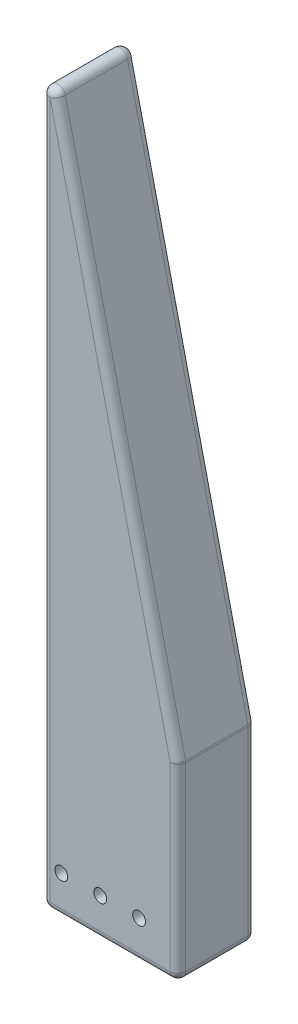
ISO-10303-21;
HEADER;
FILE_DESCRIPTION(('STEP AP214'),'2;1');
FILE_NAME('part.step','',(''),(''),'','','');
FILE_SCHEMA(('AUTOMOTIVE_DESIGN { 1 0 10303 214 1 1 1 1 }'));
ENDSEC;
DATA;
#1=APPLICATION_CONTEXT('core data for automotive mechanical design processes');
#2=APPLICATION_PROTOCOL_DEFINITION('international standard','automotive_design',2000,#1);
#3=PRODUCT_CONTEXT('',#1,'mechanical');
#4=PRODUCT('Part','Part','',(#3));
#5=PRODUCT_RELATED_PRODUCT_CATEGORY('part','',(#4));
#6=PRODUCT_DEFINITION_FORMATION('','',#4);
#7=PRODUCT_DEFINITION_CONTEXT('part definition',#1,'design');
#8=PRODUCT_DEFINITION('design','',#6,#7);
#9=PRODUCT_DEFINITION_SHAPE('','',#8);
#10=(LENGTH_UNIT() NAMED_UNIT(*) SI_UNIT(.MILLI.,.METRE.));
#11=(NAMED_UNIT(*) PLANE_ANGLE_UNIT() SI_UNIT($,.RADIAN.));
#12=(NAMED_UNIT(*) SI_UNIT($,.STERADIAN.) SOLID_ANGLE_UNIT());
#13=UNCERTAINTY_MEASURE_WITH_UNIT(LENGTH_MEASURE(1.E-05),#10,'distance_accuracy_value','');
#14=(GEOMETRIC_REPRESENTATION_CONTEXT(3) GLOBAL_UNCERTAINTY_ASSIGNED_CONTEXT((#13)) GLOBAL_UNIT_ASSIGNED_CONTEXT((#10,
#11,#12)) REPRESENTATION_CONTEXT('',''));
#15=CARTESIAN_POINT('',(0.,0.,0.));
#16=DIRECTION('',(0.,0.,1.));
#17=DIRECTION('',(1.,0.,0.));
#18=AXIS2_PLACEMENT_3D('',#15,#16,#17);
#19=CARTESIAN_POINT('',(48.599616303112,8.04367159339267,25.4));
#20=DIRECTION('',(1.,0.,0.));
#21=DIRECTION('',(0.,0.,-1.));
#22=AXIS2_PLACEMENT_3D('',#19,#20,#21);
#23=PLANE('',#22);
#24=DIRECTION('',(0.,-1.,0.));
#25=VECTOR('',#24,1.);
#26=CARTESIAN_POINT('',(48.599616303112,260.300358648793,22.86));
#27=LINE('',#26,#25);
#28=CARTESIAN_POINT('',(48.599616303112,10.5836715933927,22.86));
#29=VERTEX_POINT('',#28);
#30=CARTESIAN_POINT('',(48.599616303112,238.192735532687,22.86));
#31=VERTEX_POINT('',#30);
#32=EDGE_CURVE('E181',#29,#31,#27,.F.);
#33=ORIENTED_EDGE('',*,*,#32,.T.);
#34=DIRECTION('',(0.,0.,-1.));
#35=VECTOR('',#34,1.);
#36=CARTESIAN_POINT('',(48.599616303112,238.192735532687,25.4));
#37=LINE('',#36,#35);
#38=CARTESIAN_POINT('',(48.599616303112,238.192735532687,2.54));
#39=VERTEX_POINT('',#38);
#40=EDGE_CURVE('E184',#31,#39,#37,.T.);
#41=ORIENTED_EDGE('',*,*,#40,.T.);
#42=DIRECTION('',(0.,-1.,0.));
#43=VECTOR('',#42,1.);
#44=CARTESIAN_POINT('',(48.599616303112,8.04367159339267,2.54));
#45=LINE('',#44,#43);
#46=CARTESIAN_POINT('',(48.599616303112,10.5836715933927,2.54));
#47=VERTEX_POINT('',#46);
#48=EDGE_CURVE('E179',#39,#47,#45,.T.);
#49=ORIENTED_EDGE('',*,*,#48,.T.);
#50=DIRECTION('',(0.,0.,-1.));
#51=VECTOR('',#50,1.);
#52=CARTESIAN_POINT('',(48.599616303112,10.5836715933927,25.4));
#53=LINE('',#52,#51);
#54=EDGE_CURVE('E177',#47,#29,#53,.F.);
#55=ORIENTED_EDGE('',*,*,#54,.T.);
#56=EDGE_LOOP('',(#33,#41,#49,#55));
#57=FACE_BOUND('',#56,.T.);
#58=ADVANCED_FACE('F33',(#57),#23,.F.);
#59=CARTESIAN_POINT('',(92.9226162993558,8.04367159339267,25.4));
#60=DIRECTION('',(0.,1.,0.));
#61=DIRECTION('',(0.,0.,1.));
#62=AXIS2_PLACEMENT_3D('',#59,#60,#61);
#63=PLANE('',#62);
#64=DIRECTION('',(1.,0.,0.));
#65=VECTOR('',#64,1.);
#66=CARTESIAN_POINT('',(92.9226162993558,8.04367159339267,2.54));
#67=LINE('',#66,#65);
#68=CARTESIAN_POINT('',(51.139616303112,8.04367159339267,2.54));
#69=VERTEX_POINT('',#68);
#70=CARTESIAN_POINT('',(90.3826162993558,8.04367159339267,2.54));
#71=VERTEX_POINT('',#70);
#72=EDGE_CURVE('E197',#69,#71,#67,.T.);
#73=ORIENTED_EDGE('',*,*,#72,.T.);
#74=DIRECTION('',(0.,0.,-1.));
#75=VECTOR('',#74,1.);
#76=CARTESIAN_POINT('',(90.3826162993558,8.04367159339267,25.4));
#77=LINE('',#76,#75);
#78=CARTESIAN_POINT('',(90.3826162993558,8.04367159339267,22.86));
#79=VERTEX_POINT('',#78);
#80=EDGE_CURVE('E200',#71,#79,#77,.F.);
#81=ORIENTED_EDGE('',*,*,#80,.T.);
#82=DIRECTION('',(1.,0.,0.));
#83=VECTOR('',#82,1.);
#84=CARTESIAN_POINT('',(48.599616303112,8.04367159339267,22.86));
#85=LINE('',#84,#83);
#86=CARTESIAN_POINT('',(51.139616303112,8.04367159339267,22.86));
#87=VERTEX_POINT('',#86);
#88=EDGE_CURVE('E140',#79,#87,#85,.F.);
#89=ORIENTED_EDGE('',*,*,#88,.T.);
#90=DIRECTION('',(0.,0.,-1.));
#91=VECTOR('',#90,1.);
#92=CARTESIAN_POINT('',(51.139616303112,8.04367159339267,25.4));
#93=LINE('',#92,#91);
#94=EDGE_CURVE('E195',#87,#69,#93,.T.);
#95=ORIENTED_EDGE('',*,*,#94,.T.);
#96=EDGE_LOOP('',(#73,#81,#89,#95));
#97=FACE_BOUND('',#96,.T.);
#98=ADVANCED_FACE('F297',(#97),#63,.F.);
#99=CARTESIAN_POINT('',(92.9226162993558,8.04367159339267,25.4));
#100=DIRECTION('',(-1.,0.,0.));
#101=DIRECTION('',(0.,0.,1.));
#102=AXIS2_PLACEMENT_3D('',#99,#100,#101);
#103=PLANE('',#102);
#104=DIRECTION('',(0.,1.,0.));
#105=VECTOR('',#104,1.);
#106=CARTESIAN_POINT('',(92.9226162993558,8.04367159339267,22.86));
#107=LINE('',#106,#105);
#108=CARTESIAN_POINT('',(92.9226162993558,69.6657100867779,22.86));
#109=VERTEX_POINT('',#108);
#110=CARTESIAN_POINT('',(92.9226162993558,10.5836715933927,22.86));
#111=VERTEX_POINT('',#110);
#112=EDGE_CURVE('E53',#109,#111,#107,.F.);
#113=ORIENTED_EDGE('',*,*,#112,.T.);
#114=DIRECTION('',(0.,0.,-1.));
#115=VECTOR('',#114,1.);
#116=CARTESIAN_POINT('',(92.9226162993558,10.5836715933927,25.4));
#117=LINE('',#116,#115);
#118=CARTESIAN_POINT('',(92.9226162993558,10.5836715933927,2.54));
#119=VERTEX_POINT('',#118);
#120=EDGE_CURVE('E11',#111,#119,#117,.T.);
#121=ORIENTED_EDGE('',*,*,#120,.T.);
#122=DIRECTION('',(0.,1.,0.));
#123=VECTOR('',#122,1.);
#124=CARTESIAN_POINT('',(92.9226162993558,8.04367159339267,2.54));
#125=LINE('',#124,#123);
#126=CARTESIAN_POINT('',(92.9226162993558,69.6657100867779,2.54));
#127=VERTEX_POINT('',#126);
#128=EDGE_CURVE('E42',#119,#127,#125,.T.);
#129=ORIENTED_EDGE('',*,*,#128,.T.);
#130=DIRECTION('',(0.,0.,-1.));
#131=VECTOR('',#130,1.);
#132=CARTESIAN_POINT('',(92.9226162993558,69.6657100867779,25.4));
#133=LINE('',#132,#131);
#134=EDGE_CURVE('E202',#127,#109,#133,.F.);
#135=ORIENTED_EDGE('',*,*,#134,.T.);
#136=EDGE_LOOP('',(#113,#121,#129,#135));
#137=FACE_BOUND('',#136,.T.);
#138=ADVANCED_FACE('F303',(#137),#103,.F.);
#139=CARTESIAN_POINT('',(92.9226162993558,69.9575370265677,25.4));
#140=DIRECTION('',(-0.973943383515077,-0.226791282255742,0.));
#141=DIRECTION('',(0.226791282255742,-0.973943383515077,0.));
#142=AXIS2_PLACEMENT_3D('',#139,#140,#141);
#143=PLANE('',#142);
#144=DIRECTION('',(-0.226791282255742,0.973943383515077,0.));
#145=VECTOR('',#144,1.);
#146=CARTESIAN_POINT('',(92.9226162993558,69.9575370265677,22.86));
#147=LINE('',#146,#145);
#148=CARTESIAN_POINT('',(53.6134324972403,238.768785389617,22.86));
#149=VERTEX_POINT('',#148);
#150=CARTESIAN_POINT('',(92.8564324934841,70.2417599437075,22.86));
#151=VERTEX_POINT('',#150);
#152=EDGE_CURVE('E172',#149,#151,#147,.F.);
#153=ORIENTED_EDGE('',*,*,#152,.T.);
#154=DIRECTION('',(0.,0.,-1.));
#155=VECTOR('',#154,1.);
#156=CARTESIAN_POINT('',(92.8564324934841,70.2417599437075,25.4));
#157=LINE('',#156,#155);
#158=CARTESIAN_POINT('',(92.8564324934841,70.2417599437075,2.54));
#159=VERTEX_POINT('',#158);
#160=EDGE_CURVE('E175',#151,#159,#157,.T.);
#161=ORIENTED_EDGE('',*,*,#160,.T.);
#162=DIRECTION('',(-0.226791282255742,0.973943383515077,0.));
#163=VECTOR('',#162,1.);
#164=CARTESIAN_POINT('',(92.9226162993558,69.9575370265677,2.54));
#165=LINE('',#164,#163);
#166=CARTESIAN_POINT('',(53.6134324972403,238.768785389617,2.54));
#167=VERTEX_POINT('',#166);
#168=EDGE_CURVE('E170',#159,#167,#165,.T.);
#169=ORIENTED_EDGE('',*,*,#168,.T.);
#170=DIRECTION('',(0.,0.,-1.));
#171=VECTOR('',#170,1.);
#172=CARTESIAN_POINT('',(53.6134324972403,238.768785389617,25.4));
#173=LINE('',#172,#171);
#174=EDGE_CURVE('E168',#167,#149,#173,.F.);
#175=ORIENTED_EDGE('',*,*,#174,.T.);
#176=EDGE_LOOP('',(#153,#161,#169,#175));
#177=FACE_BOUND('',#176,.T.);
#178=ADVANCED_FACE('F292',(#177),#143,.F.);
#179=CARTESIAN_POINT('',(0.,0.,25.4));
#180=DIRECTION('',(0.,0.,1.));
#181=DIRECTION('',(1.,0.,0.));
#182=AXIS2_PLACEMENT_3D('',#179,#180,#181);
#183=PLANE('',#182);
#184=DIRECTION('',(0.,1.,0.));
#185=VECTOR('',#184,1.);
#186=CARTESIAN_POINT('',(90.3826162993558,69.9575370265677,25.4));
#187=LINE('',#186,#185);
#188=CARTESIAN_POINT('',(90.3826162993558,10.5836715933927,25.4));
#189=VERTEX_POINT('',#188);
#190=CARTESIAN_POINT('',(90.3826162993558,69.6657100867779,25.4));
#191=VERTEX_POINT('',#190);
#192=EDGE_CURVE('E126',#189,#191,#187,.T.);
#193=ORIENTED_EDGE('',*,*,#192,.T.);
#194=DIRECTION('',(-0.226791282255742,0.973943383515077,0.));
#195=VECTOR('',#194,1.);
#196=CARTESIAN_POINT('',(46.1258001089837,259.724308791863,25.4));
#197=LINE('',#196,#195);
#198=CARTESIAN_POINT('',(51.139616303112,238.192735532687,25.4));
#199=VERTEX_POINT('',#198);
#200=EDGE_CURVE('E166',#191,#199,#197,.T.);
#201=ORIENTED_EDGE('',*,*,#200,.T.);
#202=DIRECTION('',(0.,-1.,0.));
#203=VECTOR('',#202,1.);
#204=CARTESIAN_POINT('',(51.139616303112,8.04367159339267,25.4));
#205=LINE('',#204,#203);
#206=CARTESIAN_POINT('',(51.139616303112,10.5836715933927,25.4));
#207=VERTEX_POINT('',#206);
#208=EDGE_CURVE('E129',#199,#207,#205,.T.);
#209=ORIENTED_EDGE('',*,*,#208,.T.);
#210=DIRECTION('',(1.,0.,0.));
#211=VECTOR('',#210,1.);
#212=CARTESIAN_POINT('',(92.9226162993558,10.5836715933927,25.4));
#213=LINE('',#212,#211);
#214=EDGE_CURVE('E120',#207,#189,#213,.T.);
#215=ORIENTED_EDGE('',*,*,#214,.T.);
#216=EDGE_LOOP('',(#193,#201,#209,#215));
#217=FACE_BOUND('',#216,.T.);
#218=CARTESIAN_POINT('',(80.222616329776,20.6166715388885,25.4));
#219=DIRECTION('',(0.,0.,-1.));
#220=DIRECTION('',(-1.,0.,0.));
#221=AXIS2_PLACEMENT_3D('',#218,#219,#220);
#222=CIRCLE('',#221,2.0955);
#223=CARTESIAN_POINT('',(78.127116329776,20.6166715388885,25.4));
#224=VERTEX_POINT('',#223);
#225=EDGE_CURVE('E264',#224,#224,#222,.T.);
#226=ORIENTED_EDGE('',*,*,#225,.T.);
#227=EDGE_LOOP('',(#226));
#228=FACE_BOUND('',#227,.T.);
#229=CARTESIAN_POINT('',(67.522616329776,20.6166715388888,25.4));
#230=DIRECTION('',(0.,0.,-1.));
#231=DIRECTION('',(-1.,0.,0.));
#232=AXIS2_PLACEMENT_3D('',#229,#230,#231);
#233=CIRCLE('',#232,2.0955);
#234=CARTESIAN_POINT('',(65.427116329776,20.6166715388888,25.4));
#235=VERTEX_POINT('',#234);
#236=EDGE_CURVE('E274',#235,#235,#233,.T.);
#237=ORIENTED_EDGE('',*,*,#236,.T.);
#238=EDGE_LOOP('',(#237));
#239=FACE_BOUND('',#238,.T.);
#240=CARTESIAN_POINT('',(54.822616329776,20.6166715388888,25.4));
#241=DIRECTION('',(0.,0.,-1.));
#242=DIRECTION('',(-1.,0.,0.));
#243=AXIS2_PLACEMENT_3D('',#240,#241,#242);
#244=CIRCLE('',#243,2.0955);
#245=CARTESIAN_POINT('',(52.727116329776,20.6166715388888,25.4));
#246=VERTEX_POINT('',#245);
#247=EDGE_CURVE('E158',#246,#246,#244,.T.);
#248=ORIENTED_EDGE('',*,*,#247,.T.);
#249=EDGE_LOOP('',(#248));
#250=FACE_BOUND('',#249,.T.);
#251=ADVANCED_FACE('F122',(#217,#228,#239,#250),#183,.T.);
#252=CARTESIAN_POINT('',(0.,0.,0.));
#253=DIRECTION('',(0.,0.,1.));
#254=DIRECTION('',(1.,0.,0.));
#255=AXIS2_PLACEMENT_3D('',#252,#253,#254);
#256=PLANE('',#255);
#257=DIRECTION('',(1.,0.,0.));
#258=VECTOR('',#257,1.);
#259=CARTESIAN_POINT('',(0.,10.5836715933927,0.));
#260=LINE('',#259,#258);
#261=CARTESIAN_POINT('',(90.3826162993558,10.5836715933927,0.));
#262=VERTEX_POINT('',#261);
#263=CARTESIAN_POINT('',(51.139616303112,10.5836715933927,0.));
#264=VERTEX_POINT('',#263);
#265=EDGE_CURVE('E190',#262,#264,#260,.F.);
#266=ORIENTED_EDGE('',*,*,#265,.T.);
#267=DIRECTION('',(0.,-1.,0.));
#268=VECTOR('',#267,1.);
#269=CARTESIAN_POINT('',(51.139616303112,0.,0.));
#270=LINE('',#269,#268);
#271=CARTESIAN_POINT('',(51.139616303112,238.192735532687,0.));
#272=VERTEX_POINT('',#271);
#273=EDGE_CURVE('E192',#264,#272,#270,.F.);
#274=ORIENTED_EDGE('',*,*,#273,.T.);
#275=DIRECTION('',(-0.226791282255742,0.973943383515077,0.));
#276=VECTOR('',#275,1.);
#277=CARTESIAN_POINT('',(101.121743224331,23.5470872310997,0.));
#278=LINE('',#277,#276);
#279=CARTESIAN_POINT('',(90.3826162993558,69.6657100867778,0.));
#280=VERTEX_POINT('',#279);
#281=EDGE_CURVE('E188',#272,#280,#278,.F.);
#282=ORIENTED_EDGE('',*,*,#281,.T.);
#283=DIRECTION('',(0.,1.,0.));
#284=VECTOR('',#283,1.);
#285=CARTESIAN_POINT('',(90.3826162993558,0.,0.));
#286=LINE('',#285,#284);
#287=EDGE_CURVE('E186',#280,#262,#286,.F.);
#288=ORIENTED_EDGE('',*,*,#287,.T.);
#289=EDGE_LOOP('',(#266,#274,#282,#288));
#290=FACE_BOUND('',#289,.T.);
#291=CARTESIAN_POINT('',(80.222616329776,20.6166715388885,0.));
#292=DIRECTION('',(0.,0.,-1.));
#293=DIRECTION('',(-1.,0.,0.));
#294=AXIS2_PLACEMENT_3D('',#291,#292,#293);
#295=CIRCLE('',#294,2.09549999999999);
#296=CARTESIAN_POINT('',(78.127116329776,20.6166715388885,0.));
#297=VERTEX_POINT('',#296);
#298=EDGE_CURVE('E258',#297,#297,#295,.T.);
#299=ORIENTED_EDGE('',*,*,#298,.F.);
#300=EDGE_LOOP('',(#299));
#301=FACE_BOUND('',#300,.T.);
#302=CARTESIAN_POINT('',(67.522616329776,20.6166715388888,0.));
#303=DIRECTION('',(0.,0.,-1.));
#304=DIRECTION('',(-1.,0.,0.));
#305=AXIS2_PLACEMENT_3D('',#302,#303,#304);
#306=CIRCLE('',#305,2.09549999999999);
#307=CARTESIAN_POINT('',(65.427116329776,20.6166715388888,0.));
#308=VERTEX_POINT('',#307);
#309=EDGE_CURVE('E269',#308,#308,#306,.T.);
#310=ORIENTED_EDGE('',*,*,#309,.F.);
#311=EDGE_LOOP('',(#310));
#312=FACE_BOUND('',#311,.T.);
#313=CARTESIAN_POINT('',(54.822616329776,20.6166715388888,0.));
#314=DIRECTION('',(0.,0.,-1.));
#315=DIRECTION('',(-1.,0.,0.));
#316=AXIS2_PLACEMENT_3D('',#313,#314,#315);
#317=CIRCLE('',#316,2.09549999999999);
#318=CARTESIAN_POINT('',(52.727116329776,20.6166715388888,0.));
#319=VERTEX_POINT('',#318);
#320=EDGE_CURVE('E161',#319,#319,#317,.T.);
#321=ORIENTED_EDGE('',*,*,#320,.F.);
#322=EDGE_LOOP('',(#321));
#323=FACE_BOUND('',#322,.T.);
#324=ADVANCED_FACE('F281',(#290,#301,#312,#323),#256,.F.);
#325=CARTESIAN_POINT('',(54.822616329776,20.6166715388888,0.));
#326=DIRECTION('',(0.,0.,-1.));
#327=DIRECTION('',(-1.,0.,0.));
#328=AXIS2_PLACEMENT_3D('',#325,#326,#327);
#329=CYLINDRICAL_SURFACE('',#328,2.09549999999999);
#330=ORIENTED_EDGE('',*,*,#247,.F.);
#331=EDGE_LOOP('',(#330));
#332=FACE_BOUND('',#331,.T.);
#333=ORIENTED_EDGE('',*,*,#320,.T.);
#334=EDGE_LOOP('',(#333));
#335=FACE_BOUND('',#334,.T.);
#336=ADVANCED_FACE('F279',(#332,#335),#329,.F.);
#337=CARTESIAN_POINT('',(67.522616329776,20.6166715388888,0.));
#338=DIRECTION('',(0.,0.,-1.));
#339=DIRECTION('',(-1.,0.,0.));
#340=AXIS2_PLACEMENT_3D('',#337,#338,#339);
#341=CYLINDRICAL_SURFACE('',#340,2.09549999999999);
#342=ORIENTED_EDGE('',*,*,#236,.F.);
#343=EDGE_LOOP('',(#342));
#344=FACE_BOUND('',#343,.T.);
#345=ORIENTED_EDGE('',*,*,#309,.T.);
#346=EDGE_LOOP('',(#345));
#347=FACE_BOUND('',#346,.T.);
#348=ADVANCED_FACE('F289',(#344,#347),#341,.F.);
#349=CARTESIAN_POINT('',(80.222616329776,20.6166715388885,0.));
#350=DIRECTION('',(0.,0.,-1.));
#351=DIRECTION('',(-1.,0.,0.));
#352=AXIS2_PLACEMENT_3D('',#349,#350,#351);
#353=CYLINDRICAL_SURFACE('',#352,2.09549999999999);
#354=ORIENTED_EDGE('',*,*,#225,.F.);
#355=EDGE_LOOP('',(#354));
#356=FACE_BOUND('',#355,.T.);
#357=ORIENTED_EDGE('',*,*,#298,.T.);
#358=EDGE_LOOP('',(#357));
#359=FACE_BOUND('',#358,.T.);
#360=ADVANCED_FACE('F377',(#356,#359),#353,.F.);
#361=CARTESIAN_POINT('',(92.9226162993558,10.5836715933927,2.54));
#362=DIRECTION('',(1.,0.,0.));
#363=DIRECTION('',(0.,0.,-1.));
#364=AXIS2_PLACEMENT_3D('',#361,#362,#363);
#365=CYLINDRICAL_SURFACE('',#364,2.54);
#366=CARTESIAN_POINT('',(90.3826162993558,10.5836715933927,2.54));
#367=DIRECTION('',(1.,0.,0.));
#368=DIRECTION('',(0.,0.,-1.));
#369=AXIS2_PLACEMENT_3D('',#366,#367,#368);
#370=CIRCLE('',#369,2.54);
#371=EDGE_CURVE('E37',#71,#262,#370,.T.);
#372=ORIENTED_EDGE('',*,*,#371,.F.);
#373=ORIENTED_EDGE('',*,*,#72,.F.);
#374=CARTESIAN_POINT('',(51.139616303112,10.5836715933927,2.54));
#375=DIRECTION('',(-1.,0.,0.));
#376=DIRECTION('',(0.,0.,1.));
#377=AXIS2_PLACEMENT_3D('',#374,#375,#376);
#378=CIRCLE('',#377,2.54);
#379=EDGE_CURVE('E251',#264,#69,#378,.T.);
#380=ORIENTED_EDGE('',*,*,#379,.F.);
#381=ORIENTED_EDGE('',*,*,#265,.F.);
#382=EDGE_LOOP('',(#372,#373,#380,#381));
#383=FACE_BOUND('',#382,.T.);
#384=ADVANCED_FACE('F35',(#383),#365,.T.);
#385=CARTESIAN_POINT('',(90.3826162993558,10.5836715933927,2.54));
#386=DIRECTION('',(0.,0.,1.));
#387=DIRECTION('',(1.,0.,0.));
#388=AXIS2_PLACEMENT_3D('',#385,#386,#387);
#389=SPHERICAL_SURFACE('',#388,2.54);
#390=CARTESIAN_POINT('',(90.3826162993558,10.5836715933927,2.54));
#391=DIRECTION('',(0.,0.,-1.));
#392=DIRECTION('',(-1.,0.,0.));
#393=AXIS2_PLACEMENT_3D('',#390,#391,#392);
#394=CIRCLE('',#393,2.54);
#395=EDGE_CURVE('E247',#71,#119,#394,.F.);
#396=ORIENTED_EDGE('',*,*,#395,.F.);
#397=ORIENTED_EDGE('',*,*,#371,.T.);
#398=CARTESIAN_POINT('',(90.3826162993558,10.5836715933927,2.54));
#399=DIRECTION('',(0.,-1.,0.));
#400=DIRECTION('',(0.,0.,-1.));
#401=AXIS2_PLACEMENT_3D('',#398,#399,#400);
#402=CIRCLE('',#401,2.54);
#403=EDGE_CURVE('E249',#119,#262,#402,.F.);
#404=ORIENTED_EDGE('',*,*,#403,.F.);
#405=EDGE_LOOP('',(#396,#397,#404));
#406=FACE_BOUND('',#405,.T.);
#407=ADVANCED_FACE('F372',(#406),#389,.T.);
#408=CARTESIAN_POINT('',(51.139616303112,10.5836715933927,2.54));
#409=DIRECTION('',(0.,0.,1.));
#410=DIRECTION('',(1.,0.,0.));
#411=AXIS2_PLACEMENT_3D('',#408,#409,#410);
#412=SPHERICAL_SURFACE('',#411,2.54);
#413=CARTESIAN_POINT('',(51.139616303112,10.5836715933927,2.54));
#414=DIRECTION('',(0.,-1.,0.));
#415=DIRECTION('',(0.,0.,-1.));
#416=AXIS2_PLACEMENT_3D('',#413,#414,#415);
#417=CIRCLE('',#416,2.54);
#418=EDGE_CURVE('E241',#264,#47,#417,.F.);
#419=ORIENTED_EDGE('',*,*,#418,.F.);
#420=ORIENTED_EDGE('',*,*,#379,.T.);
#421=CARTESIAN_POINT('',(51.139616303112,10.5836715933927,2.54));
#422=DIRECTION('',(0.,0.,-1.));
#423=DIRECTION('',(-1.,0.,0.));
#424=AXIS2_PLACEMENT_3D('',#421,#422,#423);
#425=CIRCLE('',#424,2.54);
#426=EDGE_CURVE('E244',#47,#69,#425,.F.);
#427=ORIENTED_EDGE('',*,*,#426,.F.);
#428=EDGE_LOOP('',(#419,#420,#427));
#429=FACE_BOUND('',#428,.T.);
#430=ADVANCED_FACE('F369',(#429),#412,.T.);
#431=CARTESIAN_POINT('',(90.3826162993558,8.04367159339267,2.54));
#432=DIRECTION('',(0.,1.,0.));
#433=DIRECTION('',(0.,0.,1.));
#434=AXIS2_PLACEMENT_3D('',#431,#432,#433);
#435=CYLINDRICAL_SURFACE('',#434,2.54);
#436=ORIENTED_EDGE('',*,*,#403,.T.);
#437=ORIENTED_EDGE('',*,*,#287,.F.);
#438=CARTESIAN_POINT('',(90.3826162993558,69.6657100867779,2.54));
#439=DIRECTION('',(0.,1.,0.));
#440=DIRECTION('',(0.,0.,1.));
#441=AXIS2_PLACEMENT_3D('',#438,#439,#440);
#442=CIRCLE('',#441,2.54);
#443=EDGE_CURVE('E235',#127,#280,#442,.T.);
#444=ORIENTED_EDGE('',*,*,#443,.F.);
#445=ORIENTED_EDGE('',*,*,#128,.F.);
#446=EDGE_LOOP('',(#436,#437,#444,#445));
#447=FACE_BOUND('',#446,.T.);
#448=ADVANCED_FACE('F365',(#447),#435,.T.);
#449=CARTESIAN_POINT('',(90.3826162993558,10.5836715933927,25.4));
#450=DIRECTION('',(0.,0.,-1.));
#451=DIRECTION('',(-1.,0.,0.));
#452=AXIS2_PLACEMENT_3D('',#449,#450,#451);
#453=CYLINDRICAL_SURFACE('',#452,2.54);
#454=ORIENTED_EDGE('',*,*,#395,.T.);
#455=ORIENTED_EDGE('',*,*,#120,.F.);
#456=CARTESIAN_POINT('',(90.3826162993558,10.5836715933927,22.86));
#457=DIRECTION('',(0.,0.,1.));
#458=DIRECTION('',(1.,0.,0.));
#459=AXIS2_PLACEMENT_3D('',#456,#457,#458);
#460=CIRCLE('',#459,2.54);
#461=EDGE_CURVE('E144',#79,#111,#460,.T.);
#462=ORIENTED_EDGE('',*,*,#461,.F.);
#463=ORIENTED_EDGE('',*,*,#80,.F.);
#464=EDGE_LOOP('',(#454,#455,#462,#463));
#465=FACE_BOUND('',#464,.T.);
#466=ADVANCED_FACE('F362',(#465),#453,.T.);
#467=CARTESIAN_POINT('',(0.,10.5836715933927,22.86));
#468=DIRECTION('',(-1.,0.,0.));
#469=DIRECTION('',(0.,0.,1.));
#470=AXIS2_PLACEMENT_3D('',#467,#468,#469);
#471=CYLINDRICAL_SURFACE('',#470,2.54);
#472=CARTESIAN_POINT('',(51.139616303112,10.5836715933927,22.86));
#473=DIRECTION('',(-1.,0.,0.));
#474=DIRECTION('',(0.,0.,1.));
#475=AXIS2_PLACEMENT_3D('',#472,#473,#474);
#476=CIRCLE('',#475,2.54);
#477=EDGE_CURVE('E145',#87,#207,#476,.T.);
#478=ORIENTED_EDGE('',*,*,#477,.F.);
#479=ORIENTED_EDGE('',*,*,#88,.F.);
#480=CARTESIAN_POINT('',(90.3826162993558,10.5836715933927,22.86));
#481=DIRECTION('',(1.,0.,0.));
#482=DIRECTION('',(0.,0.,-1.));
#483=AXIS2_PLACEMENT_3D('',#480,#481,#482);
#484=CIRCLE('',#483,2.54);
#485=EDGE_CURVE('E136',#189,#79,#484,.T.);
#486=ORIENTED_EDGE('',*,*,#485,.F.);
#487=ORIENTED_EDGE('',*,*,#214,.F.);
#488=EDGE_LOOP('',(#478,#479,#486,#487));
#489=FACE_BOUND('',#488,.T.);
#490=ADVANCED_FACE('F138',(#489),#471,.T.);
#491=CARTESIAN_POINT('',(51.139616303112,10.5836715933927,25.4));
#492=DIRECTION('',(0.,0.,-1.));
#493=DIRECTION('',(-1.,0.,0.));
#494=AXIS2_PLACEMENT_3D('',#491,#492,#493);
#495=CYLINDRICAL_SURFACE('',#494,2.54);
#496=ORIENTED_EDGE('',*,*,#426,.T.);
#497=ORIENTED_EDGE('',*,*,#94,.F.);
#498=CARTESIAN_POINT('',(51.139616303112,10.5836715933927,22.86));
#499=DIRECTION('',(0.,0.,1.));
#500=DIRECTION('',(1.,0.,0.));
#501=AXIS2_PLACEMENT_3D('',#498,#499,#500);
#502=CIRCLE('',#501,2.54);
#503=EDGE_CURVE('E231',#29,#87,#502,.T.);
#504=ORIENTED_EDGE('',*,*,#503,.F.);
#505=ORIENTED_EDGE('',*,*,#54,.F.);
#506=EDGE_LOOP('',(#496,#497,#504,#505));
#507=FACE_BOUND('',#506,.T.);
#508=ADVANCED_FACE('F355',(#507),#495,.T.);
#509=CARTESIAN_POINT('',(51.139616303112,8.04367159339267,2.54));
#510=DIRECTION('',(0.,-1.,0.));
#511=DIRECTION('',(0.,0.,-1.));
#512=AXIS2_PLACEMENT_3D('',#509,#510,#511);
#513=CYLINDRICAL_SURFACE('',#512,2.54);
#514=ORIENTED_EDGE('',*,*,#418,.T.);
#515=ORIENTED_EDGE('',*,*,#48,.F.);
#516=CARTESIAN_POINT('',(51.139616303112,238.192735532687,2.54));
#517=DIRECTION('',(0.,1.,0.));
#518=DIRECTION('',(-1.,0.,0.));
#519=AXIS2_PLACEMENT_3D('',#516,#517,#518);
#520=CIRCLE('',#519,2.54);
#521=EDGE_CURVE('E228',#272,#39,#520,.T.);
#522=ORIENTED_EDGE('',*,*,#521,.F.);
#523=ORIENTED_EDGE('',*,*,#273,.F.);
#524=EDGE_LOOP('',(#514,#515,#522,#523));
#525=FACE_BOUND('',#524,.T.);
#526=ADVANCED_FACE('F351',(#525),#513,.T.);
#527=CARTESIAN_POINT('',(90.4488001052275,69.3814871696381,2.54));
#528=DIRECTION('',(-0.226791282255742,0.973943383515077,0.));
#529=DIRECTION('',(-0.973943383515077,-0.226791282255742,0.));
#530=AXIS2_PLACEMENT_3D('',#527,#528,#529);
#531=CYLINDRICAL_SURFACE('',#530,2.54);
#532=CARTESIAN_POINT('',(90.3826162993558,69.6657100867778,2.54));
#533=DIRECTION('',(0.226791282255749,-0.973943383515075,0.));
#534=DIRECTION('',(0.973943383515075,0.226791282255749,0.));
#535=AXIS2_PLACEMENT_3D('',#532,#533,#534);
#536=CIRCLE('',#535,2.54);
#537=EDGE_CURVE('E238',#280,#159,#536,.T.);
#538=ORIENTED_EDGE('',*,*,#537,.F.);
#539=ORIENTED_EDGE('',*,*,#281,.F.);
#540=CARTESIAN_POINT('',(51.139616303112,238.192735532687,2.54));
#541=DIRECTION('',(-0.22679128225574,0.973943383515077,0.));
#542=DIRECTION('',(-0.973943383515078,-0.22679128225574,0.));
#543=AXIS2_PLACEMENT_3D('',#540,#541,#542);
#544=CIRCLE('',#543,2.54);
#545=EDGE_CURVE('E226',#167,#272,#544,.T.);
#546=ORIENTED_EDGE('',*,*,#545,.F.);
#547=ORIENTED_EDGE('',*,*,#168,.F.);
#548=EDGE_LOOP('',(#538,#539,#546,#547));
#549=FACE_BOUND('',#548,.T.);
#550=ADVANCED_FACE('F347',(#549),#531,.T.);
#551=CARTESIAN_POINT('',(90.3826162993558,69.6657100867779,2.54));
#552=DIRECTION('',(0.,0.,1.));
#553=DIRECTION('',(1.,0.,0.));
#554=AXIS2_PLACEMENT_3D('',#551,#552,#553);
#555=SPHERICAL_SURFACE('',#554,2.54);
#556=ORIENTED_EDGE('',*,*,#443,.T.);
#557=ORIENTED_EDGE('',*,*,#537,.T.);
#558=CARTESIAN_POINT('',(90.3826162993558,69.6657100867779,2.54));
#559=DIRECTION('',(0.,0.,-1.));
#560=DIRECTION('',(-1.,0.,0.));
#561=AXIS2_PLACEMENT_3D('',#558,#559,#560);
#562=CIRCLE('',#561,2.54);
#563=EDGE_CURVE('E151',#127,#159,#562,.F.);
#564=ORIENTED_EDGE('',*,*,#563,.F.);
#565=EDGE_LOOP('',(#556,#557,#564));
#566=FACE_BOUND('',#565,.T.);
#567=ADVANCED_FACE('F344',(#566),#555,.T.);
#568=CARTESIAN_POINT('',(90.3826162993558,10.5836715933927,22.86));
#569=DIRECTION('',(0.,0.,1.));
#570=DIRECTION('',(1.,0.,0.));
#571=AXIS2_PLACEMENT_3D('',#568,#569,#570);
#572=SPHERICAL_SURFACE('',#571,2.54);
#573=ORIENTED_EDGE('',*,*,#485,.T.);
#574=ORIENTED_EDGE('',*,*,#461,.T.);
#575=CARTESIAN_POINT('',(90.3826162993558,10.5836715933927,22.86));
#576=DIRECTION('',(0.,-1.,0.));
#577=DIRECTION('',(0.,0.,-1.));
#578=AXIS2_PLACEMENT_3D('',#575,#576,#577);
#579=CIRCLE('',#578,2.54);
#580=EDGE_CURVE('E148',#189,#111,#579,.F.);
#581=ORIENTED_EDGE('',*,*,#580,.F.);
#582=EDGE_LOOP('',(#573,#574,#581));
#583=FACE_BOUND('',#582,.T.);
#584=ADVANCED_FACE('F149',(#583),#572,.T.);
#585=CARTESIAN_POINT('',(51.139616303112,10.5836715933927,22.86));
#586=DIRECTION('',(0.,0.,1.));
#587=DIRECTION('',(1.,0.,0.));
#588=AXIS2_PLACEMENT_3D('',#585,#586,#587);
#589=SPHERICAL_SURFACE('',#588,2.54);
#590=ORIENTED_EDGE('',*,*,#503,.T.);
#591=ORIENTED_EDGE('',*,*,#477,.T.);
#592=CARTESIAN_POINT('',(51.139616303112,10.5836715933927,22.86));
#593=DIRECTION('',(0.,-1.,0.));
#594=DIRECTION('',(0.,0.,-1.));
#595=AXIS2_PLACEMENT_3D('',#592,#593,#594);
#596=CIRCLE('',#595,2.54);
#597=EDGE_CURVE('E152',#29,#207,#596,.F.);
#598=ORIENTED_EDGE('',*,*,#597,.F.);
#599=EDGE_LOOP('',(#590,#591,#598));
#600=FACE_BOUND('',#599,.T.);
#601=ADVANCED_FACE('F337',(#600),#589,.T.);
#602=CARTESIAN_POINT('',(51.139616303112,238.192735532687,2.54));
#603=DIRECTION('',(0.,0.,1.));
#604=DIRECTION('',(1.,0.,0.));
#605=AXIS2_PLACEMENT_3D('',#602,#603,#604);
#606=SPHERICAL_SURFACE('',#605,2.54);
#607=ORIENTED_EDGE('',*,*,#545,.T.);
#608=ORIENTED_EDGE('',*,*,#521,.T.);
#609=CARTESIAN_POINT('',(51.139616303112,238.192735532687,2.54));
#610=DIRECTION('',(0.,0.,-1.));
#611=DIRECTION('',(-1.,0.,0.));
#612=AXIS2_PLACEMENT_3D('',#609,#610,#611);
#613=CIRCLE('',#612,2.54);
#614=EDGE_CURVE('E219',#167,#39,#613,.F.);
#615=ORIENTED_EDGE('',*,*,#614,.F.);
#616=EDGE_LOOP('',(#607,#608,#615));
#617=FACE_BOUND('',#616,.T.);
#618=ADVANCED_FACE('F333',(#617),#606,.T.);
#619=CARTESIAN_POINT('',(90.3826162993558,69.6657100867779,25.4));
#620=DIRECTION('',(0.,0.,-1.));
#621=DIRECTION('',(-1.,0.,0.));
#622=AXIS2_PLACEMENT_3D('',#619,#620,#621);
#623=CYLINDRICAL_SURFACE('',#622,2.54);
#624=ORIENTED_EDGE('',*,*,#563,.T.);
#625=ORIENTED_EDGE('',*,*,#160,.F.);
#626=CARTESIAN_POINT('',(90.3826162993558,69.6657100867779,22.86));
#627=DIRECTION('',(0.,0.,1.));
#628=DIRECTION('',(1.,0.,0.));
#629=AXIS2_PLACEMENT_3D('',#626,#627,#628);
#630=CIRCLE('',#629,2.54);
#631=EDGE_CURVE('E216',#109,#151,#630,.T.);
#632=ORIENTED_EDGE('',*,*,#631,.F.);
#633=ORIENTED_EDGE('',*,*,#134,.F.);
#634=EDGE_LOOP('',(#624,#625,#632,#633));
#635=FACE_BOUND('',#634,.T.);
#636=ADVANCED_FACE('F330',(#635),#623,.T.);
#637=CARTESIAN_POINT('',(90.3826162993558,0.,22.86));
#638=DIRECTION('',(0.,-1.,0.));
#639=DIRECTION('',(0.,0.,-1.));
#640=AXIS2_PLACEMENT_3D('',#637,#638,#639);
#641=CYLINDRICAL_SURFACE('',#640,2.54);
#642=ORIENTED_EDGE('',*,*,#580,.T.);
#643=ORIENTED_EDGE('',*,*,#112,.F.);
#644=CARTESIAN_POINT('',(90.3826162993558,69.6657100867779,22.86));
#645=DIRECTION('',(0.,1.,0.));
#646=DIRECTION('',(-1.,0.,0.));
#647=AXIS2_PLACEMENT_3D('',#644,#645,#646);
#648=CIRCLE('',#647,2.54);
#649=EDGE_CURVE('E156',#191,#109,#648,.T.);
#650=ORIENTED_EDGE('',*,*,#649,.F.);
#651=ORIENTED_EDGE('',*,*,#192,.F.);
#652=EDGE_LOOP('',(#642,#643,#650,#651));
#653=FACE_BOUND('',#652,.T.);
#654=ADVANCED_FACE('F154',(#653),#641,.T.);
#655=CARTESIAN_POINT('',(51.139616303112,0.,22.86));
#656=DIRECTION('',(0.,1.,0.));
#657=DIRECTION('',(0.,0.,1.));
#658=AXIS2_PLACEMENT_3D('',#655,#656,#657);
#659=CYLINDRICAL_SURFACE('',#658,2.54);
#660=ORIENTED_EDGE('',*,*,#597,.T.);
#661=ORIENTED_EDGE('',*,*,#208,.F.);
#662=CARTESIAN_POINT('',(51.139616303112,238.192735532687,22.86));
#663=DIRECTION('',(0.,1.,0.));
#664=DIRECTION('',(0.,0.,1.));
#665=AXIS2_PLACEMENT_3D('',#662,#663,#664);
#666=CIRCLE('',#665,2.54);
#667=EDGE_CURVE('E212',#31,#199,#666,.T.);
#668=ORIENTED_EDGE('',*,*,#667,.F.);
#669=ORIENTED_EDGE('',*,*,#32,.F.);
#670=EDGE_LOOP('',(#660,#661,#668,#669));
#671=FACE_BOUND('',#670,.T.);
#672=ADVANCED_FACE('F323',(#671),#659,.T.);
#673=CARTESIAN_POINT('',(51.139616303112,238.192735532687,25.4));
#674=DIRECTION('',(0.,0.,-1.));
#675=DIRECTION('',(-1.,0.,0.));
#676=AXIS2_PLACEMENT_3D('',#673,#674,#675);
#677=CYLINDRICAL_SURFACE('',#676,2.54);
#678=ORIENTED_EDGE('',*,*,#614,.T.);
#679=ORIENTED_EDGE('',*,*,#40,.F.);
#680=CARTESIAN_POINT('',(51.139616303112,238.192735532687,22.86));
#681=DIRECTION('',(0.,0.,1.));
#682=DIRECTION('',(1.,0.,0.));
#683=AXIS2_PLACEMENT_3D('',#680,#681,#682);
#684=CIRCLE('',#683,2.54);
#685=EDGE_CURVE('E210',#149,#31,#684,.T.);
#686=ORIENTED_EDGE('',*,*,#685,.F.);
#687=ORIENTED_EDGE('',*,*,#174,.F.);
#688=EDGE_LOOP('',(#678,#679,#686,#687));
#689=FACE_BOUND('',#688,.T.);
#690=ADVANCED_FACE('F319',(#689),#677,.T.);
#691=CARTESIAN_POINT('',(90.3826162993558,69.6657100867779,22.86));
#692=DIRECTION('',(0.,0.,1.));
#693=DIRECTION('',(1.,0.,0.));
#694=AXIS2_PLACEMENT_3D('',#691,#692,#693);
#695=SPHERICAL_SURFACE('',#694,2.54);
#696=ORIENTED_EDGE('',*,*,#649,.T.);
#697=ORIENTED_EDGE('',*,*,#631,.T.);
#698=CARTESIAN_POINT('',(90.3826162993558,69.6657100867779,22.86));
#699=DIRECTION('',(0.226791282255739,-0.973943383515078,0.));
#700=DIRECTION('',(0.973943383515078,0.226791282255739,0.));
#701=AXIS2_PLACEMENT_3D('',#698,#699,#700);
#702=CIRCLE('',#701,2.54);
#703=EDGE_CURVE('E208',#191,#151,#702,.F.);
#704=ORIENTED_EDGE('',*,*,#703,.F.);
#705=EDGE_LOOP('',(#696,#697,#704));
#706=FACE_BOUND('',#705,.T.);
#707=ADVANCED_FACE('F315',(#706),#695,.T.);
#708=CARTESIAN_POINT('',(51.139616303112,238.192735532687,22.86));
#709=DIRECTION('',(0.,0.,1.));
#710=DIRECTION('',(1.,0.,0.));
#711=AXIS2_PLACEMENT_3D('',#708,#709,#710);
#712=SPHERICAL_SURFACE('',#711,2.54);
#713=ORIENTED_EDGE('',*,*,#685,.T.);
#714=ORIENTED_EDGE('',*,*,#667,.T.);
#715=CARTESIAN_POINT('',(51.139616303112,238.192735532687,22.86));
#716=DIRECTION('',(-0.226791282255729,0.97394338351508,0.));
#717=DIRECTION('',(-0.97394338351508,-0.226791282255729,0.));
#718=AXIS2_PLACEMENT_3D('',#715,#716,#717);
#719=CIRCLE('',#718,2.54);
#720=EDGE_CURVE('E206',#149,#199,#719,.F.);
#721=ORIENTED_EDGE('',*,*,#720,.F.);
#722=EDGE_LOOP('',(#713,#714,#721));
#723=FACE_BOUND('',#722,.T.);
#724=ADVANCED_FACE('F311',(#723),#712,.T.);
#725=CARTESIAN_POINT('',(101.121743224331,23.5470872310997,22.86));
#726=DIRECTION('',(0.226791282255742,-0.973943383515077,0.));
#727=DIRECTION('',(0.973943383515077,0.226791282255742,0.));
#728=AXIS2_PLACEMENT_3D('',#725,#726,#727);
#729=CYLINDRICAL_SURFACE('',#728,2.54);
#730=ORIENTED_EDGE('',*,*,#703,.T.);
#731=ORIENTED_EDGE('',*,*,#152,.F.);
#732=ORIENTED_EDGE('',*,*,#720,.T.);
#733=ORIENTED_EDGE('',*,*,#200,.F.);
#734=EDGE_LOOP('',(#730,#731,#732,#733));
#735=FACE_BOUND('',#734,.T.);
#736=ADVANCED_FACE('F308',(#735),#729,.T.);
#737=CLOSED_SHELL('',(#58,#98,#138,#178,#251,#324,#336,#348,#360,#384,#407,#430,#448,#466,#490,
#508,#526,#550,#567,#584,#601,#618,#636,#654,#672,#690,#707,#724,#736));
#738=MANIFOLD_SOLID_BREP('B2',#737);
#739=ADVANCED_BREP_SHAPE_REPRESENTATION('',(#18,#738),#14);
#740=SHAPE_DEFINITION_REPRESENTATION(#9,#739);
ENDSEC;
END-ISO-10303-21;
